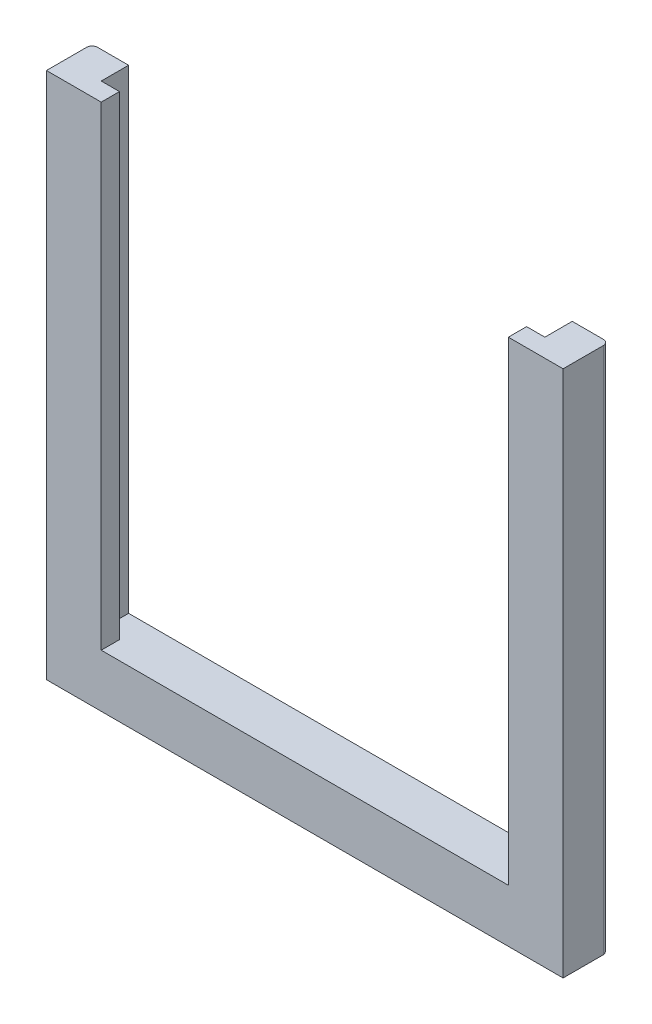
ISO-10303-21;
HEADER;
FILE_DESCRIPTION(('STEP AP214'),'2;1');
FILE_NAME('part.step','',(''),(''),'','','');
FILE_SCHEMA(('AUTOMOTIVE_DESIGN { 1 0 10303 214 1 1 1 1 }'));
ENDSEC;
DATA;
#1=APPLICATION_CONTEXT('core data for automotive mechanical design processes');
#2=APPLICATION_PROTOCOL_DEFINITION('international standard','automotive_design',2000,#1);
#3=PRODUCT_CONTEXT('',#1,'mechanical');
#4=PRODUCT('Part','Part','',(#3));
#5=PRODUCT_RELATED_PRODUCT_CATEGORY('part','',(#4));
#6=PRODUCT_DEFINITION_FORMATION('','',#4);
#7=PRODUCT_DEFINITION_CONTEXT('part definition',#1,'design');
#8=PRODUCT_DEFINITION('design','',#6,#7);
#9=PRODUCT_DEFINITION_SHAPE('','',#8);
#10=(LENGTH_UNIT() NAMED_UNIT(*) SI_UNIT(.MILLI.,.METRE.));
#11=(NAMED_UNIT(*) PLANE_ANGLE_UNIT() SI_UNIT($,.RADIAN.));
#12=(NAMED_UNIT(*) SI_UNIT($,.STERADIAN.) SOLID_ANGLE_UNIT());
#13=UNCERTAINTY_MEASURE_WITH_UNIT(LENGTH_MEASURE(1.E-05),#10,'distance_accuracy_value','');
#14=(GEOMETRIC_REPRESENTATION_CONTEXT(3) GLOBAL_UNCERTAINTY_ASSIGNED_CONTEXT((#13)) GLOBAL_UNIT_ASSIGNED_CONTEXT((#10,
#11,#12)) REPRESENTATION_CONTEXT('',''));
#15=CARTESIAN_POINT('',(0.,0.,0.));
#16=DIRECTION('',(0.,0.,1.));
#17=DIRECTION('',(1.,0.,0.));
#18=AXIS2_PLACEMENT_3D('',#15,#16,#17);
#19=CARTESIAN_POINT('',(0.,28.9,2.50000000000001));
#20=DIRECTION('',(0.,-1.,0.));
#21=DIRECTION('',(0.,0.,-1.));
#22=AXIS2_PLACEMENT_3D('',#19,#20,#21);
#23=PLANE('',#22);
#24=DIRECTION('',(-1.,0.,0.));
#25=VECTOR('',#24,1.);
#26=CARTESIAN_POINT('',(0.,28.9,0.));
#27=LINE('',#26,#25);
#28=CARTESIAN_POINT('',(28.,28.9,0.));
#29=VERTEX_POINT('',#28);
#30=CARTESIAN_POINT('',(26.3,28.9,0.));
#31=VERTEX_POINT('',#30);
#32=EDGE_CURVE('E169',#29,#31,#27,.T.);
#33=ORIENTED_EDGE('',*,*,#32,.T.);
#34=DIRECTION('',(0.,0.,-1.));
#35=VECTOR('',#34,1.);
#36=CARTESIAN_POINT('',(26.3,28.9,0.));
#37=LINE('',#36,#35);
#38=CARTESIAN_POINT('',(26.3,28.9,1.5));
#39=VERTEX_POINT('',#38);
#40=EDGE_CURVE('E244',#39,#31,#37,.T.);
#41=ORIENTED_EDGE('',*,*,#40,.F.);
#42=DIRECTION('',(1.,0.,0.));
#43=VECTOR('',#42,1.);
#44=CARTESIAN_POINT('',(26.3,28.9,1.5));
#45=LINE('',#44,#43);
#46=CARTESIAN_POINT('',(25.3,28.9,1.5));
#47=VERTEX_POINT('',#46);
#48=EDGE_CURVE('E217',#47,#39,#45,.T.);
#49=ORIENTED_EDGE('',*,*,#48,.F.);
#50=DIRECTION('',(0.,0.,-1.));
#51=VECTOR('',#50,1.);
#52=CARTESIAN_POINT('',(25.3,28.9,1.5));
#53=LINE('',#52,#51);
#54=CARTESIAN_POINT('',(25.3,28.9,2.50000000000001));
#55=VERTEX_POINT('',#54);
#56=EDGE_CURVE('E239',#55,#47,#53,.T.);
#57=ORIENTED_EDGE('',*,*,#56,.F.);
#58=DIRECTION('',(-1.,0.,0.));
#59=VECTOR('',#58,1.);
#60=CARTESIAN_POINT('',(0.,28.9,2.50000000000001));
#61=LINE('',#60,#59);
#62=CARTESIAN_POINT('',(28.3,28.9,2.50000000000001));
#63=VERTEX_POINT('',#62);
#64=EDGE_CURVE('E174',#63,#55,#61,.T.);
#65=ORIENTED_EDGE('',*,*,#64,.F.);
#66=DIRECTION('',(0.,0.,-1.));
#67=VECTOR('',#66,1.);
#68=CARTESIAN_POINT('',(28.3,28.9,2.50000000000001));
#69=LINE('',#68,#67);
#70=CARTESIAN_POINT('',(28.3,28.9,0.3));
#71=VERTEX_POINT('',#70);
#72=EDGE_CURVE('E181',#63,#71,#69,.T.);
#73=ORIENTED_EDGE('',*,*,#72,.T.);
#74=CARTESIAN_POINT('',(28.,28.9,0.3));
#75=DIRECTION('',(0.,-1.,0.));
#76=DIRECTION('',(0.,0.,-1.));
#77=AXIS2_PLACEMENT_3D('',#74,#75,#76);
#78=CIRCLE('',#77,0.3);
#79=EDGE_CURVE('E41',#71,#29,#78,.F.);
#80=ORIENTED_EDGE('',*,*,#79,.T.);
#81=EDGE_LOOP('',(#33,#41,#49,#57,#65,#73,#80));
#82=FACE_BOUND('',#81,.T.);
#83=ADVANCED_FACE('F32',(#82),#23,.F.);
#84=CARTESIAN_POINT('',(0.,0.,2.50000000000001));
#85=DIRECTION('',(1.,0.,0.));
#86=DIRECTION('',(0.,0.,-1.));
#87=AXIS2_PLACEMENT_3D('',#84,#85,#86);
#88=PLANE('',#87);
#89=DIRECTION('',(0.,0.,-1.));
#90=VECTOR('',#89,1.);
#91=CARTESIAN_POINT('',(0.,28.9,2.50000000000001));
#92=LINE('',#91,#90);
#93=CARTESIAN_POINT('',(0.,28.9,2.50000000000001));
#94=VERTEX_POINT('',#93);
#95=CARTESIAN_POINT('',(0.,28.9,0.3));
#96=VERTEX_POINT('',#95);
#97=EDGE_CURVE('E177',#94,#96,#92,.T.);
#98=ORIENTED_EDGE('',*,*,#97,.T.);
#99=DIRECTION('',(0.,-1.,0.));
#100=VECTOR('',#99,1.);
#101=CARTESIAN_POINT('',(0.,0.,0.3));
#102=LINE('',#101,#100);
#103=CARTESIAN_POINT('',(0.,0.,0.3));
#104=VERTEX_POINT('',#103);
#105=EDGE_CURVE('E11',#96,#104,#102,.T.);
#106=ORIENTED_EDGE('',*,*,#105,.T.);
#107=DIRECTION('',(0.,0.,-1.));
#108=VECTOR('',#107,1.);
#109=CARTESIAN_POINT('',(0.,0.,2.50000000000001));
#110=LINE('',#109,#108);
#111=CARTESIAN_POINT('',(0.,0.,2.50000000000001));
#112=VERTEX_POINT('',#111);
#113=EDGE_CURVE('E187',#112,#104,#110,.T.);
#114=ORIENTED_EDGE('',*,*,#113,.F.);
#115=DIRECTION('',(0.,-1.,0.));
#116=VECTOR('',#115,1.);
#117=CARTESIAN_POINT('',(0.,0.,2.50000000000001));
#118=LINE('',#117,#116);
#119=EDGE_CURVE('E165',#94,#112,#118,.T.);
#120=ORIENTED_EDGE('',*,*,#119,.F.);
#121=EDGE_LOOP('',(#98,#106,#114,#120));
#122=FACE_BOUND('',#121,.T.);
#123=ADVANCED_FACE('F283',(#122),#88,.F.);
#124=CARTESIAN_POINT('',(0.,0.,2.50000000000001));
#125=DIRECTION('',(0.,1.,0.));
#126=DIRECTION('',(0.,0.,1.));
#127=AXIS2_PLACEMENT_3D('',#124,#125,#126);
#128=PLANE('',#127);
#129=ORIENTED_EDGE('',*,*,#113,.T.);
#130=DIRECTION('',(1.,0.,0.));
#131=VECTOR('',#130,1.);
#132=CARTESIAN_POINT('',(28.3,0.,0.3));
#133=LINE('',#132,#131);
#134=CARTESIAN_POINT('',(28.3,0.,0.3));
#135=VERTEX_POINT('',#134);
#136=EDGE_CURVE('E190',#104,#135,#133,.T.);
#137=ORIENTED_EDGE('',*,*,#136,.T.);
#138=DIRECTION('',(0.,0.,-1.));
#139=VECTOR('',#138,1.);
#140=CARTESIAN_POINT('',(28.3,0.,2.50000000000001));
#141=LINE('',#140,#139);
#142=CARTESIAN_POINT('',(28.3,0.,2.50000000000001));
#143=VERTEX_POINT('',#142);
#144=EDGE_CURVE('E184',#143,#135,#141,.T.);
#145=ORIENTED_EDGE('',*,*,#144,.F.);
#146=DIRECTION('',(1.,0.,0.));
#147=VECTOR('',#146,1.);
#148=CARTESIAN_POINT('',(0.,0.,2.50000000000001));
#149=LINE('',#148,#147);
#150=EDGE_CURVE('E168',#112,#143,#149,.T.);
#151=ORIENTED_EDGE('',*,*,#150,.F.);
#152=EDGE_LOOP('',(#129,#137,#145,#151));
#153=FACE_BOUND('',#152,.T.);
#154=ADVANCED_FACE('F272',(#153),#128,.F.);
#155=CARTESIAN_POINT('',(28.3,0.,2.50000000000001));
#156=DIRECTION('',(-1.,0.,0.));
#157=DIRECTION('',(0.,0.,1.));
#158=AXIS2_PLACEMENT_3D('',#155,#156,#157);
#159=PLANE('',#158);
#160=ORIENTED_EDGE('',*,*,#144,.T.);
#161=DIRECTION('',(0.,1.,0.));
#162=VECTOR('',#161,1.);
#163=CARTESIAN_POINT('',(28.3,28.9,0.3));
#164=LINE('',#163,#162);
#165=EDGE_CURVE('E199',#135,#71,#164,.T.);
#166=ORIENTED_EDGE('',*,*,#165,.T.);
#167=ORIENTED_EDGE('',*,*,#72,.F.);
#168=DIRECTION('',(0.,1.,0.));
#169=VECTOR('',#168,1.);
#170=CARTESIAN_POINT('',(28.3,0.,2.50000000000001));
#171=LINE('',#170,#169);
#172=EDGE_CURVE('E171',#143,#63,#171,.T.);
#173=ORIENTED_EDGE('',*,*,#172,.F.);
#174=EDGE_LOOP('',(#160,#166,#167,#173));
#175=FACE_BOUND('',#174,.T.);
#176=ADVANCED_FACE('F276',(#175),#159,.F.);
#177=CARTESIAN_POINT('',(3.,28.9,2.50000000000001));
#178=VERTEX_POINT('',#177);
#179=EDGE_CURVE('E173',#178,#94,#61,.T.);
#180=ORIENTED_EDGE('',*,*,#179,.F.);
#181=DIRECTION('',(0.,0.,1.));
#182=VECTOR('',#181,1.);
#183=CARTESIAN_POINT('',(3.,28.9,2.50000000000001));
#184=LINE('',#183,#182);
#185=CARTESIAN_POINT('',(3.,28.9,1.5));
#186=VERTEX_POINT('',#185);
#187=EDGE_CURVE('E228',#186,#178,#184,.T.);
#188=ORIENTED_EDGE('',*,*,#187,.F.);
#189=DIRECTION('',(1.,0.,0.));
#190=VECTOR('',#189,1.);
#191=CARTESIAN_POINT('',(3.,28.9,1.5));
#192=LINE('',#191,#190);
#193=CARTESIAN_POINT('',(2.,28.9,1.5));
#194=VERTEX_POINT('',#193);
#195=EDGE_CURVE('E233',#194,#186,#192,.T.);
#196=ORIENTED_EDGE('',*,*,#195,.F.);
#197=DIRECTION('',(0.,0.,1.));
#198=VECTOR('',#197,1.);
#199=CARTESIAN_POINT('',(2.,28.9,0.));
#200=LINE('',#199,#198);
#201=CARTESIAN_POINT('',(2.,28.9,0.));
#202=VERTEX_POINT('',#201);
#203=EDGE_CURVE('E235',#202,#194,#200,.T.);
#204=ORIENTED_EDGE('',*,*,#203,.F.);
#205=CARTESIAN_POINT('',(0.3,28.9,0.));
#206=VERTEX_POINT('',#205);
#207=EDGE_CURVE('E156',#202,#206,#27,.T.);
#208=ORIENTED_EDGE('',*,*,#207,.T.);
#209=CARTESIAN_POINT('',(0.3,28.9,0.3));
#210=DIRECTION('',(0.,-1.,0.));
#211=DIRECTION('',(0.,0.,-1.));
#212=AXIS2_PLACEMENT_3D('',#209,#210,#211);
#213=CIRCLE('',#212,0.3);
#214=EDGE_CURVE('E57',#206,#96,#213,.F.);
#215=ORIENTED_EDGE('',*,*,#214,.T.);
#216=ORIENTED_EDGE('',*,*,#97,.F.);
#217=EDGE_LOOP('',(#180,#188,#196,#204,#208,#215,#216));
#218=FACE_BOUND('',#217,.T.);
#219=ADVANCED_FACE('F238',(#218),#23,.F.);
#220=CARTESIAN_POINT('',(0.,0.,2.50000000000001));
#221=DIRECTION('',(0.,0.,-1.));
#222=DIRECTION('',(-1.,0.,0.));
#223=AXIS2_PLACEMENT_3D('',#220,#221,#222);
#224=PLANE('',#223);
#225=ORIENTED_EDGE('',*,*,#64,.T.);
#226=DIRECTION('',(0.,1.,0.));
#227=VECTOR('',#226,1.);
#228=CARTESIAN_POINT('',(25.3,2.9,2.50000000000001));
#229=LINE('',#228,#227);
#230=CARTESIAN_POINT('',(25.3,2.9,2.50000000000001));
#231=VERTEX_POINT('',#230);
#232=EDGE_CURVE('E214',#231,#55,#229,.T.);
#233=ORIENTED_EDGE('',*,*,#232,.F.);
#234=DIRECTION('',(1.,0.,0.));
#235=VECTOR('',#234,1.);
#236=CARTESIAN_POINT('',(25.3,2.9,2.50000000000001));
#237=LINE('',#236,#235);
#238=CARTESIAN_POINT('',(3.,2.9,2.50000000000001));
#239=VERTEX_POINT('',#238);
#240=EDGE_CURVE('E250',#239,#231,#237,.T.);
#241=ORIENTED_EDGE('',*,*,#240,.F.);
#242=DIRECTION('',(0.,1.,0.));
#243=VECTOR('',#242,1.);
#244=CARTESIAN_POINT('',(3.,2.9,2.50000000000001));
#245=LINE('',#244,#243);
#246=EDGE_CURVE('E221',#239,#178,#245,.T.);
#247=ORIENTED_EDGE('',*,*,#246,.T.);
#248=ORIENTED_EDGE('',*,*,#179,.T.);
#249=ORIENTED_EDGE('',*,*,#119,.T.);
#250=ORIENTED_EDGE('',*,*,#150,.T.);
#251=ORIENTED_EDGE('',*,*,#172,.T.);
#252=EDGE_LOOP('',(#225,#233,#241,#247,#248,#249,#250,#251));
#253=FACE_BOUND('',#252,.T.);
#254=ADVANCED_FACE('F279',(#253),#224,.F.);
#255=CARTESIAN_POINT('',(0.,0.,0.));
#256=DIRECTION('',(0.,0.,-1.));
#257=DIRECTION('',(-1.,0.,0.));
#258=AXIS2_PLACEMENT_3D('',#255,#256,#257);
#259=PLANE('',#258);
#260=DIRECTION('',(0.,1.,0.));
#261=VECTOR('',#260,1.);
#262=CARTESIAN_POINT('',(26.3,2.9,0.));
#263=LINE('',#262,#261);
#264=CARTESIAN_POINT('',(26.3,2.9,0.));
#265=VERTEX_POINT('',#264);
#266=EDGE_CURVE('E157',#265,#31,#263,.T.);
#267=ORIENTED_EDGE('',*,*,#266,.T.);
#268=ORIENTED_EDGE('',*,*,#32,.F.);
#269=DIRECTION('',(0.,1.,0.));
#270=VECTOR('',#269,1.);
#271=CARTESIAN_POINT('',(28.,0.,0.));
#272=LINE('',#271,#270);
#273=CARTESIAN_POINT('',(28.,0.3,0.));
#274=VERTEX_POINT('',#273);
#275=EDGE_CURVE('E197',#29,#274,#272,.F.);
#276=ORIENTED_EDGE('',*,*,#275,.T.);
#277=DIRECTION('',(1.,0.,0.));
#278=VECTOR('',#277,1.);
#279=CARTESIAN_POINT('',(0.,0.3,0.));
#280=LINE('',#279,#278);
#281=CARTESIAN_POINT('',(0.3,0.3,0.));
#282=VERTEX_POINT('',#281);
#283=EDGE_CURVE('E195',#274,#282,#280,.F.);
#284=ORIENTED_EDGE('',*,*,#283,.T.);
#285=DIRECTION('',(0.,-1.,0.));
#286=VECTOR('',#285,1.);
#287=CARTESIAN_POINT('',(0.3,28.9,0.));
#288=LINE('',#287,#286);
#289=EDGE_CURVE('E193',#282,#206,#288,.F.);
#290=ORIENTED_EDGE('',*,*,#289,.T.);
#291=ORIENTED_EDGE('',*,*,#207,.F.);
#292=DIRECTION('',(0.,1.,0.));
#293=VECTOR('',#292,1.);
#294=CARTESIAN_POINT('',(2.,2.9,0.));
#295=LINE('',#294,#293);
#296=CARTESIAN_POINT('',(2.,2.9,0.));
#297=VERTEX_POINT('',#296);
#298=EDGE_CURVE('E140',#297,#202,#295,.T.);
#299=ORIENTED_EDGE('',*,*,#298,.F.);
#300=DIRECTION('',(-1.,0.,0.));
#301=VECTOR('',#300,1.);
#302=CARTESIAN_POINT('',(26.3,2.9,0.));
#303=LINE('',#302,#301);
#304=EDGE_CURVE('E146',#265,#297,#303,.T.);
#305=ORIENTED_EDGE('',*,*,#304,.F.);
#306=EDGE_LOOP('',(#267,#268,#276,#284,#290,#291,#299,#305));
#307=FACE_BOUND('',#306,.T.);
#308=ADVANCED_FACE('F154',(#307),#259,.T.);
#309=CARTESIAN_POINT('',(0.3,0.,0.3));
#310=DIRECTION('',(0.,1.,0.));
#311=DIRECTION('',(0.,0.,1.));
#312=AXIS2_PLACEMENT_3D('',#309,#310,#311);
#313=CYLINDRICAL_SURFACE('',#312,0.3);
#314=ORIENTED_EDGE('',*,*,#214,.F.);
#315=ORIENTED_EDGE('',*,*,#289,.F.);
#316=CARTESIAN_POINT('',(0.3,0.3,0.3));
#317=DIRECTION('',(-0.707106781186547,0.707106781186547,0.));
#318=DIRECTION('',(0.707106781186547,0.707106781186547,0.));
#319=AXIS2_PLACEMENT_3D('',#316,#317,#318);
#320=ELLIPSE('',#319,0.424264068711928,0.3);
#321=EDGE_CURVE('E36',#104,#282,#320,.F.);
#322=ORIENTED_EDGE('',*,*,#321,.F.);
#323=ORIENTED_EDGE('',*,*,#105,.F.);
#324=EDGE_LOOP('',(#314,#315,#322,#323));
#325=FACE_BOUND('',#324,.T.);
#326=ADVANCED_FACE('F34',(#325),#313,.T.);
#327=CARTESIAN_POINT('',(28.,0.,0.3));
#328=DIRECTION('',(0.,-1.,0.));
#329=DIRECTION('',(0.,0.,-1.));
#330=AXIS2_PLACEMENT_3D('',#327,#328,#329);
#331=CYLINDRICAL_SURFACE('',#330,0.3);
#332=ORIENTED_EDGE('',*,*,#79,.F.);
#333=ORIENTED_EDGE('',*,*,#165,.F.);
#334=CARTESIAN_POINT('',(28.,0.3,0.3));
#335=DIRECTION('',(-0.707106781186547,-0.707106781186547,0.));
#336=DIRECTION('',(0.707106781186547,-0.707106781186547,0.));
#337=AXIS2_PLACEMENT_3D('',#334,#335,#336);
#338=ELLIPSE('',#337,0.424264068711928,0.3);
#339=EDGE_CURVE('E202',#274,#135,#338,.T.);
#340=ORIENTED_EDGE('',*,*,#339,.F.);
#341=ORIENTED_EDGE('',*,*,#275,.F.);
#342=EDGE_LOOP('',(#332,#333,#340,#341));
#343=FACE_BOUND('',#342,.T.);
#344=ADVANCED_FACE('F267',(#343),#331,.T.);
#345=CARTESIAN_POINT('',(0.,0.3,0.3));
#346=DIRECTION('',(-1.,0.,0.));
#347=DIRECTION('',(0.,0.,1.));
#348=AXIS2_PLACEMENT_3D('',#345,#346,#347);
#349=CYLINDRICAL_SURFACE('',#348,0.3);
#350=ORIENTED_EDGE('',*,*,#321,.T.);
#351=ORIENTED_EDGE('',*,*,#283,.F.);
#352=ORIENTED_EDGE('',*,*,#339,.T.);
#353=ORIENTED_EDGE('',*,*,#136,.F.);
#354=EDGE_LOOP('',(#350,#351,#352,#353));
#355=FACE_BOUND('',#354,.T.);
#356=ADVANCED_FACE('F287',(#355),#349,.T.);
#357=CARTESIAN_POINT('',(26.3,2.9,0.));
#358=DIRECTION('',(1.,0.,0.));
#359=DIRECTION('',(0.,0.,-1.));
#360=AXIS2_PLACEMENT_3D('',#357,#358,#359);
#361=PLANE('',#360);
#362=ORIENTED_EDGE('',*,*,#40,.T.);
#363=ORIENTED_EDGE('',*,*,#266,.F.);
#364=DIRECTION('',(0.,0.,-1.));
#365=VECTOR('',#364,1.);
#366=CARTESIAN_POINT('',(26.3,2.9,0.));
#367=LINE('',#366,#365);
#368=CARTESIAN_POINT('',(26.3,2.9,1.5));
#369=VERTEX_POINT('',#368);
#370=EDGE_CURVE('E49',#369,#265,#367,.T.);
#371=ORIENTED_EDGE('',*,*,#370,.F.);
#372=DIRECTION('',(0.,1.,0.));
#373=VECTOR('',#372,1.);
#374=CARTESIAN_POINT('',(26.3,2.9,1.5));
#375=LINE('',#374,#373);
#376=EDGE_CURVE('E203',#369,#39,#375,.T.);
#377=ORIENTED_EDGE('',*,*,#376,.T.);
#378=EDGE_LOOP('',(#362,#363,#371,#377));
#379=FACE_BOUND('',#378,.T.);
#380=ADVANCED_FACE('F263',(#379),#361,.F.);
#381=CARTESIAN_POINT('',(26.3,2.9,1.5));
#382=DIRECTION('',(0.,0.,1.));
#383=DIRECTION('',(1.,0.,0.));
#384=AXIS2_PLACEMENT_3D('',#381,#382,#383);
#385=PLANE('',#384);
#386=ORIENTED_EDGE('',*,*,#48,.T.);
#387=ORIENTED_EDGE('',*,*,#376,.F.);
#388=DIRECTION('',(1.,0.,0.));
#389=VECTOR('',#388,1.);
#390=CARTESIAN_POINT('',(26.3,2.9,1.5));
#391=LINE('',#390,#389);
#392=CARTESIAN_POINT('',(25.3,2.9,1.5));
#393=VERTEX_POINT('',#392);
#394=EDGE_CURVE('E161',#393,#369,#391,.T.);
#395=ORIENTED_EDGE('',*,*,#394,.F.);
#396=DIRECTION('',(0.,1.,0.));
#397=VECTOR('',#396,1.);
#398=CARTESIAN_POINT('',(25.3,2.9,1.5));
#399=LINE('',#398,#397);
#400=EDGE_CURVE('E210',#393,#47,#399,.T.);
#401=ORIENTED_EDGE('',*,*,#400,.T.);
#402=EDGE_LOOP('',(#386,#387,#395,#401));
#403=FACE_BOUND('',#402,.T.);
#404=ADVANCED_FACE('F258',(#403),#385,.F.);
#405=CARTESIAN_POINT('',(25.3,2.9,1.5));
#406=DIRECTION('',(1.,0.,0.));
#407=DIRECTION('',(0.,0.,-1.));
#408=AXIS2_PLACEMENT_3D('',#405,#406,#407);
#409=PLANE('',#408);
#410=ORIENTED_EDGE('',*,*,#56,.T.);
#411=ORIENTED_EDGE('',*,*,#400,.F.);
#412=DIRECTION('',(0.,0.,-1.));
#413=VECTOR('',#412,1.);
#414=CARTESIAN_POINT('',(25.3,2.9,1.5));
#415=LINE('',#414,#413);
#416=EDGE_CURVE('E247',#231,#393,#415,.T.);
#417=ORIENTED_EDGE('',*,*,#416,.F.);
#418=ORIENTED_EDGE('',*,*,#232,.T.);
#419=EDGE_LOOP('',(#410,#411,#417,#418));
#420=FACE_BOUND('',#419,.T.);
#421=ADVANCED_FACE('F374',(#420),#409,.F.);
#422=CARTESIAN_POINT('',(3.,2.9,2.50000000000001));
#423=DIRECTION('',(-1.,0.,0.));
#424=DIRECTION('',(0.,0.,1.));
#425=AXIS2_PLACEMENT_3D('',#422,#423,#424);
#426=PLANE('',#425);
#427=ORIENTED_EDGE('',*,*,#187,.T.);
#428=ORIENTED_EDGE('',*,*,#246,.F.);
#429=DIRECTION('',(0.,0.,1.));
#430=VECTOR('',#429,1.);
#431=CARTESIAN_POINT('',(3.,2.9,2.50000000000001));
#432=LINE('',#431,#430);
#433=CARTESIAN_POINT('',(3.,2.9,1.5));
#434=VERTEX_POINT('',#433);
#435=EDGE_CURVE('E230',#434,#239,#432,.T.);
#436=ORIENTED_EDGE('',*,*,#435,.F.);
#437=DIRECTION('',(0.,1.,0.));
#438=VECTOR('',#437,1.);
#439=CARTESIAN_POINT('',(3.,2.9,1.5));
#440=LINE('',#439,#438);
#441=EDGE_CURVE('E159',#434,#186,#440,.T.);
#442=ORIENTED_EDGE('',*,*,#441,.T.);
#443=EDGE_LOOP('',(#427,#428,#436,#442));
#444=FACE_BOUND('',#443,.T.);
#445=ADVANCED_FACE('F226',(#444),#426,.F.);
#446=CARTESIAN_POINT('',(3.,2.9,1.5));
#447=DIRECTION('',(0.,0.,1.));
#448=DIRECTION('',(1.,0.,0.));
#449=AXIS2_PLACEMENT_3D('',#446,#447,#448);
#450=PLANE('',#449);
#451=ORIENTED_EDGE('',*,*,#195,.T.);
#452=ORIENTED_EDGE('',*,*,#441,.F.);
#453=DIRECTION('',(1.,0.,0.));
#454=VECTOR('',#453,1.);
#455=CARTESIAN_POINT('',(3.,2.9,1.5));
#456=LINE('',#455,#454);
#457=CARTESIAN_POINT('',(2.,2.9,1.5));
#458=VERTEX_POINT('',#457);
#459=EDGE_CURVE('E145',#458,#434,#456,.T.);
#460=ORIENTED_EDGE('',*,*,#459,.F.);
#461=DIRECTION('',(0.,1.,0.));
#462=VECTOR('',#461,1.);
#463=CARTESIAN_POINT('',(2.,2.9,1.5));
#464=LINE('',#463,#462);
#465=EDGE_CURVE('E142',#458,#194,#464,.T.);
#466=ORIENTED_EDGE('',*,*,#465,.T.);
#467=EDGE_LOOP('',(#451,#452,#460,#466));
#468=FACE_BOUND('',#467,.T.);
#469=ADVANCED_FACE('F234',(#468),#450,.F.);
#470=CARTESIAN_POINT('',(2.,2.9,0.));
#471=DIRECTION('',(-1.,0.,0.));
#472=DIRECTION('',(0.,0.,1.));
#473=AXIS2_PLACEMENT_3D('',#470,#471,#472);
#474=PLANE('',#473);
#475=ORIENTED_EDGE('',*,*,#203,.T.);
#476=ORIENTED_EDGE('',*,*,#465,.F.);
#477=DIRECTION('',(0.,0.,1.));
#478=VECTOR('',#477,1.);
#479=CARTESIAN_POINT('',(2.,2.9,0.));
#480=LINE('',#479,#478);
#481=EDGE_CURVE('E136',#297,#458,#480,.T.);
#482=ORIENTED_EDGE('',*,*,#481,.F.);
#483=ORIENTED_EDGE('',*,*,#298,.T.);
#484=EDGE_LOOP('',(#475,#476,#482,#483));
#485=FACE_BOUND('',#484,.T.);
#486=ADVANCED_FACE('F138',(#485),#474,.F.);
#487=CARTESIAN_POINT('',(0.,2.9,0.));
#488=DIRECTION('',(0.,-1.,0.));
#489=DIRECTION('',(0.,0.,-1.));
#490=AXIS2_PLACEMENT_3D('',#487,#488,#489);
#491=PLANE('',#490);
#492=ORIENTED_EDGE('',*,*,#370,.T.);
#493=ORIENTED_EDGE('',*,*,#304,.T.);
#494=ORIENTED_EDGE('',*,*,#481,.T.);
#495=ORIENTED_EDGE('',*,*,#459,.T.);
#496=ORIENTED_EDGE('',*,*,#435,.T.);
#497=ORIENTED_EDGE('',*,*,#240,.T.);
#498=ORIENTED_EDGE('',*,*,#416,.T.);
#499=ORIENTED_EDGE('',*,*,#394,.T.);
#500=EDGE_LOOP('',(#492,#493,#494,#495,#496,#497,#498,#499));
#501=FACE_BOUND('',#500,.T.);
#502=ADVANCED_FACE('F149',(#501),#491,.F.);
#503=CLOSED_SHELL('',(#83,#123,#154,#176,#219,#254,#308,#326,#344,#356,#380,#404,#421,#445,#469,
#486,#502));
#504=MANIFOLD_SOLID_BREP('B2',#503);
#505=ADVANCED_BREP_SHAPE_REPRESENTATION('',(#18,#504),#14);
#506=SHAPE_DEFINITION_REPRESENTATION(#9,#505);
ENDSEC;
END-ISO-10303-21;
